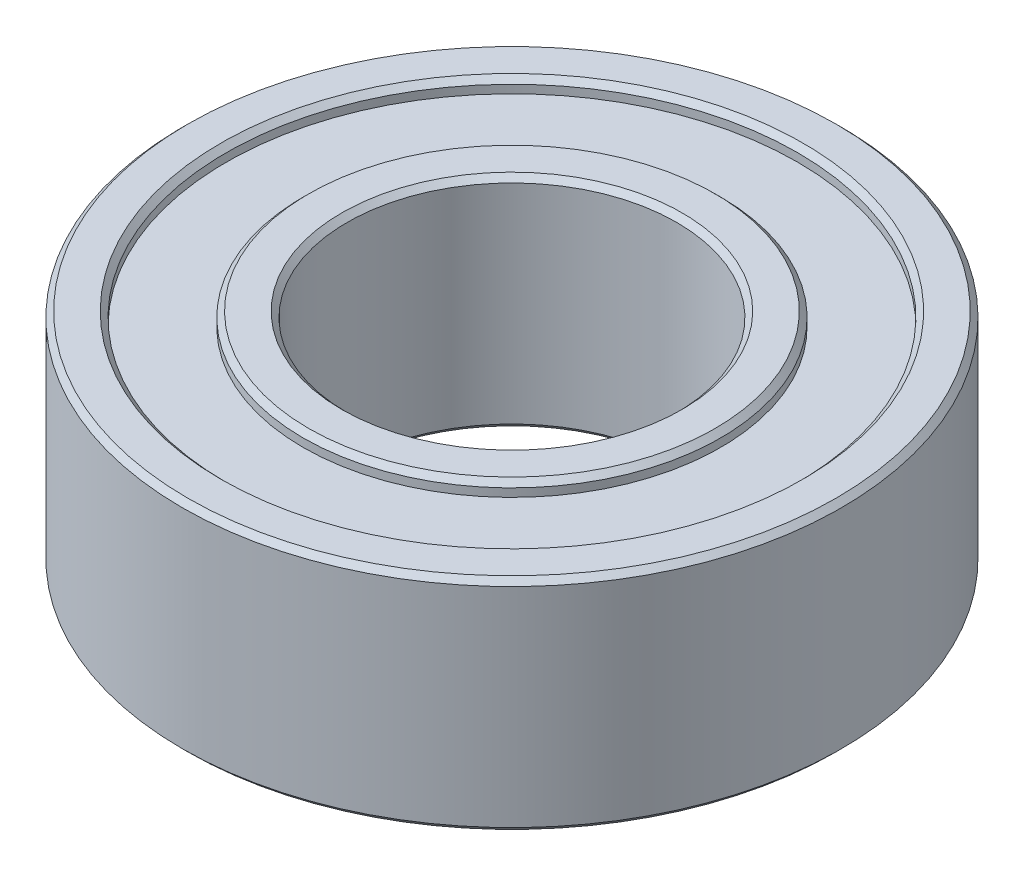
ISO-10303-21;
HEADER;
FILE_DESCRIPTION(('STEP AP214'),'2;1');
FILE_NAME('part.step','',(''),(''),'','','');
FILE_SCHEMA(('AUTOMOTIVE_DESIGN { 1 0 10303 214 1 1 1 1 }'));
ENDSEC;
DATA;
#1=APPLICATION_CONTEXT('core data for automotive mechanical design processes');
#2=APPLICATION_PROTOCOL_DEFINITION('international standard','automotive_design',2000,#1);
#3=PRODUCT_CONTEXT('',#1,'mechanical');
#4=PRODUCT('Part','Part','',(#3));
#5=PRODUCT_RELATED_PRODUCT_CATEGORY('part','',(#4));
#6=PRODUCT_DEFINITION_FORMATION('','',#4);
#7=PRODUCT_DEFINITION_CONTEXT('part definition',#1,'design');
#8=PRODUCT_DEFINITION('design','',#6,#7);
#9=PRODUCT_DEFINITION_SHAPE('','',#8);
#10=(LENGTH_UNIT() NAMED_UNIT(*) SI_UNIT(.MILLI.,.METRE.));
#11=(NAMED_UNIT(*) PLANE_ANGLE_UNIT() SI_UNIT($,.RADIAN.));
#12=(NAMED_UNIT(*) SI_UNIT($,.STERADIAN.) SOLID_ANGLE_UNIT());
#13=UNCERTAINTY_MEASURE_WITH_UNIT(LENGTH_MEASURE(1.E-05),#10,'distance_accuracy_value','');
#14=(GEOMETRIC_REPRESENTATION_CONTEXT(3) GLOBAL_UNCERTAINTY_ASSIGNED_CONTEXT((#13)) GLOBAL_UNIT_ASSIGNED_CONTEXT((#10,
#11,#12)) REPRESENTATION_CONTEXT('',''));
#15=CARTESIAN_POINT('',(0.,0.,0.));
#16=DIRECTION('',(0.,0.,1.));
#17=DIRECTION('',(1.,0.,0.));
#18=AXIS2_PLACEMENT_3D('',#15,#16,#17);
#19=CARTESIAN_POINT('',(0.,2.,0.));
#20=DIRECTION('',(0.,-1.,0.));
#21=DIRECTION('',(0.,0.,-1.));
#22=AXIS2_PLACEMENT_3D('',#19,#20,#21);
#23=CYLINDRICAL_SURFACE('',#22,3.8);
#24=CARTESIAN_POINT('',(0.,-1.9,0.));
#25=DIRECTION('',(0.,1.,0.));
#26=DIRECTION('',(0.,0.,1.));
#27=AXIS2_PLACEMENT_3D('',#24,#25,#26);
#28=CIRCLE('',#27,3.8);
#29=CARTESIAN_POINT('',(0.,-1.9,3.8));
#30=VERTEX_POINT('',#29);
#31=EDGE_CURVE('E86',#30,#30,#28,.T.);
#32=ORIENTED_EDGE('',*,*,#31,.T.);
#33=EDGE_LOOP('',(#32));
#34=FACE_BOUND('',#33,.T.);
#35=CARTESIAN_POINT('',(0.,-1.75,0.));
#36=DIRECTION('',(0.,1.,0.));
#37=DIRECTION('',(0.,0.,1.));
#38=AXIS2_PLACEMENT_3D('',#35,#36,#37);
#39=CIRCLE('',#38,3.8);
#40=CARTESIAN_POINT('',(0.,-1.75,3.8));
#41=VERTEX_POINT('',#40);
#42=EDGE_CURVE('E89',#41,#41,#39,.T.);
#43=ORIENTED_EDGE('',*,*,#42,.F.);
#44=EDGE_LOOP('',(#43));
#45=FACE_BOUND('',#44,.T.);
#46=ADVANCED_FACE('F57',(#34,#45),#23,.T.);
#47=CARTESIAN_POINT('',(0.,2.,0.));
#48=DIRECTION('',(0.,-1.,0.));
#49=DIRECTION('',(0.,0.,-1.));
#50=AXIS2_PLACEMENT_3D('',#47,#48,#49);
#51=CYLINDRICAL_SURFACE('',#50,3.);
#52=CARTESIAN_POINT('',(0.,-1.9,0.));
#53=DIRECTION('',(0.,1.,0.));
#54=DIRECTION('',(0.,0.,1.));
#55=AXIS2_PLACEMENT_3D('',#52,#53,#54);
#56=CIRCLE('',#55,3.);
#57=CARTESIAN_POINT('',(0.,-1.9,3.));
#58=VERTEX_POINT('',#57);
#59=EDGE_CURVE('E72',#58,#58,#56,.F.);
#60=ORIENTED_EDGE('',*,*,#59,.T.);
#61=EDGE_LOOP('',(#60));
#62=FACE_BOUND('',#61,.T.);
#63=CARTESIAN_POINT('',(0.,1.9,0.));
#64=DIRECTION('',(0.,1.,0.));
#65=DIRECTION('',(0.,0.,1.));
#66=AXIS2_PLACEMENT_3D('',#63,#64,#65);
#67=CIRCLE('',#66,3.);
#68=CARTESIAN_POINT('',(0.,1.9,3.));
#69=VERTEX_POINT('',#68);
#70=EDGE_CURVE('E77',#69,#69,#67,.T.);
#71=ORIENTED_EDGE('',*,*,#70,.T.);
#72=EDGE_LOOP('',(#71));
#73=FACE_BOUND('',#72,.T.);
#74=ADVANCED_FACE('F129',(#62,#73),#51,.F.);
#75=CARTESIAN_POINT('',(0.,1.90000000000001,0.));
#76=DIRECTION('',(0.,1.,0.));
#77=DIRECTION('',(0.,0.,1.));
#78=AXIS2_PLACEMENT_3D('',#75,#76,#77);
#79=CIRCLE('',#78,3.8);
#80=CARTESIAN_POINT('',(0.,1.90000000000001,3.8));
#81=VERTEX_POINT('',#80);
#82=EDGE_CURVE('E12',#81,#81,#79,.F.);
#83=ORIENTED_EDGE('',*,*,#82,.T.);
#84=EDGE_LOOP('',(#83));
#85=FACE_BOUND('',#84,.T.);
#86=CARTESIAN_POINT('',(0.,1.75,0.));
#87=DIRECTION('',(0.,1.,0.));
#88=DIRECTION('',(0.,0.,1.));
#89=AXIS2_PLACEMENT_3D('',#86,#87,#88);
#90=CIRCLE('',#89,3.8);
#91=CARTESIAN_POINT('',(0.,1.75,3.8));
#92=VERTEX_POINT('',#91);
#93=EDGE_CURVE('E96',#92,#92,#90,.T.);
#94=ORIENTED_EDGE('',*,*,#93,.T.);
#95=EDGE_LOOP('',(#94));
#96=FACE_BOUND('',#95,.T.);
#97=ADVANCED_FACE('F102',(#85,#96),#23,.T.);
#98=CARTESIAN_POINT('',(0.,2.,0.));
#99=DIRECTION('',(0.,1.,0.));
#100=DIRECTION('',(0.,0.,1.));
#101=AXIS2_PLACEMENT_3D('',#98,#99,#100);
#102=PLANE('',#101);
#103=CARTESIAN_POINT('',(0.,2.,0.));
#104=DIRECTION('',(0.,1.,0.));
#105=DIRECTION('',(0.,0.,1.));
#106=AXIS2_PLACEMENT_3D('',#103,#104,#105);
#107=CIRCLE('',#106,3.7);
#108=CARTESIAN_POINT('',(0.,2.,3.7));
#109=VERTEX_POINT('',#108);
#110=EDGE_CURVE('E64',#109,#109,#107,.T.);
#111=ORIENTED_EDGE('',*,*,#110,.T.);
#112=EDGE_LOOP('',(#111));
#113=FACE_BOUND('',#112,.T.);
#114=CARTESIAN_POINT('',(0.,2.,0.));
#115=DIRECTION('',(0.,1.,0.));
#116=DIRECTION('',(0.,0.,1.));
#117=AXIS2_PLACEMENT_3D('',#114,#115,#116);
#118=CIRCLE('',#117,3.1);
#119=CARTESIAN_POINT('',(0.,2.,3.1));
#120=VERTEX_POINT('',#119);
#121=EDGE_CURVE('E68',#120,#120,#118,.F.);
#122=ORIENTED_EDGE('',*,*,#121,.T.);
#123=EDGE_LOOP('',(#122));
#124=FACE_BOUND('',#123,.T.);
#125=ADVANCED_FACE('F141',(#113,#124),#102,.T.);
#126=CARTESIAN_POINT('',(0.,-2.,0.));
#127=DIRECTION('',(0.,1.,0.));
#128=DIRECTION('',(0.,0.,1.));
#129=AXIS2_PLACEMENT_3D('',#126,#127,#128);
#130=PLANE('',#129);
#131=CARTESIAN_POINT('',(0.,-2.,0.));
#132=DIRECTION('',(0.,1.,0.));
#133=DIRECTION('',(0.,0.,1.));
#134=AXIS2_PLACEMENT_3D('',#131,#132,#133);
#135=CIRCLE('',#134,3.7);
#136=CARTESIAN_POINT('',(0.,-2.,3.7));
#137=VERTEX_POINT('',#136);
#138=EDGE_CURVE('E80',#137,#137,#135,.F.);
#139=ORIENTED_EDGE('',*,*,#138,.T.);
#140=EDGE_LOOP('',(#139));
#141=FACE_BOUND('',#140,.T.);
#142=CARTESIAN_POINT('',(0.,-2.,0.));
#143=DIRECTION('',(0.,1.,0.));
#144=DIRECTION('',(0.,0.,1.));
#145=AXIS2_PLACEMENT_3D('',#142,#143,#144);
#146=CIRCLE('',#145,3.1);
#147=CARTESIAN_POINT('',(0.,-2.,3.1));
#148=VERTEX_POINT('',#147);
#149=EDGE_CURVE('E83',#148,#148,#146,.T.);
#150=ORIENTED_EDGE('',*,*,#149,.T.);
#151=EDGE_LOOP('',(#150));
#152=FACE_BOUND('',#151,.T.);
#153=ADVANCED_FACE('F114',(#141,#152),#130,.F.);
#154=CARTESIAN_POINT('',(0.,1.75,0.));
#155=DIRECTION('',(0.,-1.,0.));
#156=DIRECTION('',(0.,0.,-1.));
#157=AXIS2_PLACEMENT_3D('',#154,#155,#156);
#158=CYLINDRICAL_SURFACE('',#157,5.2);
#159=CARTESIAN_POINT('',(0.,1.75,0.));
#160=DIRECTION('',(0.,1.,0.));
#161=DIRECTION('',(0.,0.,1.));
#162=AXIS2_PLACEMENT_3D('',#159,#160,#161);
#163=CIRCLE('',#162,5.2);
#164=CARTESIAN_POINT('',(0.,1.75,5.2));
#165=VERTEX_POINT('',#164);
#166=EDGE_CURVE('E92',#165,#165,#163,.T.);
#167=ORIENTED_EDGE('',*,*,#166,.F.);
#168=EDGE_LOOP('',(#167));
#169=FACE_BOUND('',#168,.T.);
#170=CARTESIAN_POINT('',(0.,-1.75,0.));
#171=DIRECTION('',(0.,1.,0.));
#172=DIRECTION('',(0.,0.,1.));
#173=AXIS2_PLACEMENT_3D('',#170,#171,#172);
#174=CIRCLE('',#173,5.2);
#175=CARTESIAN_POINT('',(0.,-1.75,5.2));
#176=VERTEX_POINT('',#175);
#177=EDGE_CURVE('E93',#176,#176,#174,.T.);
#178=ORIENTED_EDGE('',*,*,#177,.T.);
#179=EDGE_LOOP('',(#178));
#180=FACE_BOUND('',#179,.T.);
#181=ADVANCED_FACE('F108',(#169,#180),#158,.T.);
#182=CARTESIAN_POINT('',(0.,1.75,0.));
#183=DIRECTION('',(0.,1.,0.));
#184=DIRECTION('',(0.,0.,1.));
#185=AXIS2_PLACEMENT_3D('',#182,#183,#184);
#186=PLANE('',#185);
#187=ORIENTED_EDGE('',*,*,#93,.F.);
#188=EDGE_LOOP('',(#187));
#189=FACE_BOUND('',#188,.T.);
#190=ORIENTED_EDGE('',*,*,#166,.T.);
#191=EDGE_LOOP('',(#190));
#192=FACE_BOUND('',#191,.T.);
#193=ADVANCED_FACE('F104',(#189,#192),#186,.T.);
#194=CARTESIAN_POINT('',(0.,-1.75,0.));
#195=DIRECTION('',(0.,1.,0.));
#196=DIRECTION('',(0.,0.,1.));
#197=AXIS2_PLACEMENT_3D('',#194,#195,#196);
#198=PLANE('',#197);
#199=ORIENTED_EDGE('',*,*,#42,.T.);
#200=EDGE_LOOP('',(#199));
#201=FACE_BOUND('',#200,.T.);
#202=ORIENTED_EDGE('',*,*,#177,.F.);
#203=EDGE_LOOP('',(#202));
#204=FACE_BOUND('',#203,.T.);
#205=ADVANCED_FACE('F107',(#201,#204),#198,.F.);
#206=CARTESIAN_POINT('',(0.,-1.9,0.));
#207=DIRECTION('',(0.,1.,0.));
#208=DIRECTION('',(0.,0.,1.));
#209=AXIS2_PLACEMENT_3D('',#206,#207,#208);
#210=CONICAL_SURFACE('',#209,3.8,0.785398163397455);
#211=ORIENTED_EDGE('',*,*,#138,.F.);
#212=EDGE_LOOP('',(#211));
#213=FACE_BOUND('',#212,.T.);
#214=ORIENTED_EDGE('',*,*,#31,.F.);
#215=EDGE_LOOP('',(#214));
#216=FACE_BOUND('',#215,.T.);
#217=ADVANCED_FACE('F119',(#213,#216),#210,.T.);
#218=CARTESIAN_POINT('',(0.,-2.,0.));
#219=DIRECTION('',(0.,-1.,0.));
#220=DIRECTION('',(0.,0.,-1.));
#221=AXIS2_PLACEMENT_3D('',#218,#219,#220);
#222=CONICAL_SURFACE('',#221,3.1,0.785398163397448);
#223=ORIENTED_EDGE('',*,*,#59,.F.);
#224=EDGE_LOOP('',(#223));
#225=FACE_BOUND('',#224,.T.);
#226=ORIENTED_EDGE('',*,*,#149,.F.);
#227=EDGE_LOOP('',(#226));
#228=FACE_BOUND('',#227,.T.);
#229=ADVANCED_FACE('F125',(#225,#228),#222,.F.);
#230=CARTESIAN_POINT('',(0.,2.,0.));
#231=DIRECTION('',(0.,-1.,0.));
#232=DIRECTION('',(0.,0.,-1.));
#233=AXIS2_PLACEMENT_3D('',#230,#231,#232);
#234=CONICAL_SURFACE('',#233,3.7,0.785398163397457);
#235=ORIENTED_EDGE('',*,*,#82,.F.);
#236=EDGE_LOOP('',(#235));
#237=FACE_BOUND('',#236,.T.);
#238=ORIENTED_EDGE('',*,*,#110,.F.);
#239=EDGE_LOOP('',(#238));
#240=FACE_BOUND('',#239,.T.);
#241=ADVANCED_FACE('F155',(#237,#240),#234,.T.);
#242=CARTESIAN_POINT('',(0.,1.9,0.));
#243=DIRECTION('',(0.,1.,0.));
#244=DIRECTION('',(0.,0.,1.));
#245=AXIS2_PLACEMENT_3D('',#242,#243,#244);
#246=CONICAL_SURFACE('',#245,3.,0.785398163397453);
#247=ORIENTED_EDGE('',*,*,#121,.F.);
#248=EDGE_LOOP('',(#247));
#249=FACE_BOUND('',#248,.T.);
#250=ORIENTED_EDGE('',*,*,#70,.F.);
#251=EDGE_LOOP('',(#250));
#252=FACE_BOUND('',#251,.T.);
#253=ADVANCED_FACE('F59',(#249,#252),#246,.F.);
#254=CLOSED_SHELL('',(#46,#74,#97,#125,#153,#181,#193,#205,#217,#229,#241,#253));
#255=MANIFOLD_SOLID_BREP('B2',#254);
#256=CARTESIAN_POINT('',(0.,2.,0.));
#257=DIRECTION('',(0.,-1.,0.));
#258=DIRECTION('',(0.,0.,-1.));
#259=AXIS2_PLACEMENT_3D('',#256,#257,#258);
#260=CYLINDRICAL_SURFACE('',#259,5.2);
#261=CARTESIAN_POINT('',(0.,1.90000000000001,0.));
#262=DIRECTION('',(0.,1.,0.));
#263=DIRECTION('',(0.,0.,1.));
#264=AXIS2_PLACEMENT_3D('',#261,#262,#263);
#265=CIRCLE('',#264,5.2);
#266=CARTESIAN_POINT('',(0.,1.90000000000001,5.2));
#267=VERTEX_POINT('',#266);
#268=EDGE_CURVE('E252',#267,#267,#265,.T.);
#269=ORIENTED_EDGE('',*,*,#268,.T.);
#270=EDGE_LOOP('',(#269));
#271=FACE_BOUND('',#270,.T.);
#272=CARTESIAN_POINT('',(0.,-1.9,0.));
#273=DIRECTION('',(0.,1.,0.));
#274=DIRECTION('',(0.,0.,1.));
#275=AXIS2_PLACEMENT_3D('',#272,#273,#274);
#276=CIRCLE('',#275,5.2);
#277=CARTESIAN_POINT('',(0.,-1.9,5.2));
#278=VERTEX_POINT('',#277);
#279=EDGE_CURVE('E255',#278,#278,#276,.F.);
#280=ORIENTED_EDGE('',*,*,#279,.T.);
#281=EDGE_LOOP('',(#280));
#282=FACE_BOUND('',#281,.T.);
#283=ADVANCED_FACE('F226',(#271,#282),#260,.F.);
#284=CARTESIAN_POINT('',(0.,2.,0.));
#285=DIRECTION('',(0.,-1.,0.));
#286=DIRECTION('',(0.,0.,-1.));
#287=AXIS2_PLACEMENT_3D('',#284,#285,#286);
#288=CYLINDRICAL_SURFACE('',#287,6.);
#289=CARTESIAN_POINT('',(0.,1.9,0.));
#290=DIRECTION('',(0.,1.,0.));
#291=DIRECTION('',(0.,0.,1.));
#292=AXIS2_PLACEMENT_3D('',#289,#290,#291);
#293=CIRCLE('',#292,6.);
#294=CARTESIAN_POINT('',(0.,1.9,6.));
#295=VERTEX_POINT('',#294);
#296=EDGE_CURVE('E237',#295,#295,#293,.F.);
#297=ORIENTED_EDGE('',*,*,#296,.T.);
#298=EDGE_LOOP('',(#297));
#299=FACE_BOUND('',#298,.T.);
#300=CARTESIAN_POINT('',(0.,-1.9,0.));
#301=DIRECTION('',(0.,1.,0.));
#302=DIRECTION('',(0.,0.,1.));
#303=AXIS2_PLACEMENT_3D('',#300,#301,#302);
#304=CIRCLE('',#303,6.);
#305=CARTESIAN_POINT('',(0.,-1.9,6.));
#306=VERTEX_POINT('',#305);
#307=EDGE_CURVE('E241',#306,#306,#304,.T.);
#308=ORIENTED_EDGE('',*,*,#307,.T.);
#309=EDGE_LOOP('',(#308));
#310=FACE_BOUND('',#309,.T.);
#311=ADVANCED_FACE('F273',(#299,#310),#288,.T.);
#312=CARTESIAN_POINT('',(0.,2.,0.));
#313=DIRECTION('',(0.,1.,0.));
#314=DIRECTION('',(0.,0.,1.));
#315=AXIS2_PLACEMENT_3D('',#312,#313,#314);
#316=PLANE('',#315);
#317=CARTESIAN_POINT('',(0.,2.,0.));
#318=DIRECTION('',(0.,1.,0.));
#319=DIRECTION('',(0.,0.,1.));
#320=AXIS2_PLACEMENT_3D('',#317,#318,#319);
#321=CIRCLE('',#320,5.3);
#322=CARTESIAN_POINT('',(0.,2.,5.3));
#323=VERTEX_POINT('',#322);
#324=EDGE_CURVE('E246',#323,#323,#321,.F.);
#325=ORIENTED_EDGE('',*,*,#324,.T.);
#326=EDGE_LOOP('',(#325));
#327=FACE_BOUND('',#326,.T.);
#328=CARTESIAN_POINT('',(0.,2.,0.));
#329=DIRECTION('',(0.,1.,0.));
#330=DIRECTION('',(0.,0.,1.));
#331=AXIS2_PLACEMENT_3D('',#328,#329,#330);
#332=CIRCLE('',#331,5.9);
#333=CARTESIAN_POINT('',(0.,2.,5.9));
#334=VERTEX_POINT('',#333);
#335=EDGE_CURVE('E249',#334,#334,#332,.T.);
#336=ORIENTED_EDGE('',*,*,#335,.T.);
#337=EDGE_LOOP('',(#336));
#338=FACE_BOUND('',#337,.T.);
#339=ADVANCED_FACE('F279',(#327,#338),#316,.T.);
#340=CARTESIAN_POINT('',(0.,-2.,0.));
#341=DIRECTION('',(0.,1.,0.));
#342=DIRECTION('',(0.,0.,1.));
#343=AXIS2_PLACEMENT_3D('',#340,#341,#342);
#344=PLANE('',#343);
#345=CARTESIAN_POINT('',(0.,-2.,0.));
#346=DIRECTION('',(0.,1.,0.));
#347=DIRECTION('',(0.,0.,1.));
#348=AXIS2_PLACEMENT_3D('',#345,#346,#347);
#349=CIRCLE('',#348,5.3);
#350=CARTESIAN_POINT('',(0.,-2.,5.3));
#351=VERTEX_POINT('',#350);
#352=EDGE_CURVE('E56',#351,#351,#349,.T.);
#353=ORIENTED_EDGE('',*,*,#352,.T.);
#354=EDGE_LOOP('',(#353));
#355=FACE_BOUND('',#354,.T.);
#356=CARTESIAN_POINT('',(0.,-2.,0.));
#357=DIRECTION('',(0.,1.,0.));
#358=DIRECTION('',(0.,0.,1.));
#359=AXIS2_PLACEMENT_3D('',#356,#357,#358);
#360=CIRCLE('',#359,5.9);
#361=CARTESIAN_POINT('',(0.,-2.,5.9));
#362=VERTEX_POINT('',#361);
#363=EDGE_CURVE('E233',#362,#362,#360,.F.);
#364=ORIENTED_EDGE('',*,*,#363,.T.);
#365=EDGE_LOOP('',(#364));
#366=FACE_BOUND('',#365,.T.);
#367=ADVANCED_FACE('F285',(#355,#366),#344,.F.);
#368=CARTESIAN_POINT('',(0.,1.90000000000001,0.));
#369=DIRECTION('',(0.,1.,0.));
#370=DIRECTION('',(0.,0.,1.));
#371=AXIS2_PLACEMENT_3D('',#368,#369,#370);
#372=CONICAL_SURFACE('',#371,5.2,0.785398163397466);
#373=ORIENTED_EDGE('',*,*,#324,.F.);
#374=EDGE_LOOP('',(#373));
#375=FACE_BOUND('',#374,.T.);
#376=ORIENTED_EDGE('',*,*,#268,.F.);
#377=EDGE_LOOP('',(#376));
#378=FACE_BOUND('',#377,.T.);
#379=ADVANCED_FACE('F269',(#375,#378),#372,.F.);
#380=CARTESIAN_POINT('',(0.,2.,0.));
#381=DIRECTION('',(0.,-1.,0.));
#382=DIRECTION('',(0.,0.,-1.));
#383=AXIS2_PLACEMENT_3D('',#380,#381,#382);
#384=CONICAL_SURFACE('',#383,5.9,0.785398163397435);
#385=ORIENTED_EDGE('',*,*,#296,.F.);
#386=EDGE_LOOP('',(#385));
#387=FACE_BOUND('',#386,.T.);
#388=ORIENTED_EDGE('',*,*,#335,.F.);
#389=EDGE_LOOP('',(#388));
#390=FACE_BOUND('',#389,.T.);
#391=ADVANCED_FACE('F263',(#387,#390),#384,.T.);
#392=CARTESIAN_POINT('',(0.,-2.,0.));
#393=DIRECTION('',(0.,-1.,0.));
#394=DIRECTION('',(0.,0.,-1.));
#395=AXIS2_PLACEMENT_3D('',#392,#393,#394);
#396=CONICAL_SURFACE('',#395,5.3,0.785398163397444);
#397=ORIENTED_EDGE('',*,*,#279,.F.);
#398=EDGE_LOOP('',(#397));
#399=FACE_BOUND('',#398,.T.);
#400=ORIENTED_EDGE('',*,*,#352,.F.);
#401=EDGE_LOOP('',(#400));
#402=FACE_BOUND('',#401,.T.);
#403=ADVANCED_FACE('F260',(#399,#402),#396,.F.);
#404=CARTESIAN_POINT('',(0.,-1.9,0.));
#405=DIRECTION('',(0.,1.,0.));
#406=DIRECTION('',(0.,0.,1.));
#407=AXIS2_PLACEMENT_3D('',#404,#405,#406);
#408=CONICAL_SURFACE('',#407,6.,0.785398163397444);
#409=ORIENTED_EDGE('',*,*,#363,.F.);
#410=EDGE_LOOP('',(#409));
#411=FACE_BOUND('',#410,.T.);
#412=ORIENTED_EDGE('',*,*,#307,.F.);
#413=EDGE_LOOP('',(#412));
#414=FACE_BOUND('',#413,.T.);
#415=ADVANCED_FACE('F228',(#411,#414),#408,.T.);
#416=CLOSED_SHELL('',(#283,#311,#339,#367,#379,#391,#403,#415));
#417=MANIFOLD_SOLID_BREP('B7',#416);
#418=ADVANCED_BREP_SHAPE_REPRESENTATION('',(#18,#255,#417),#14);
#419=SHAPE_DEFINITION_REPRESENTATION(#9,#418);
ENDSEC;
END-ISO-10303-21;
